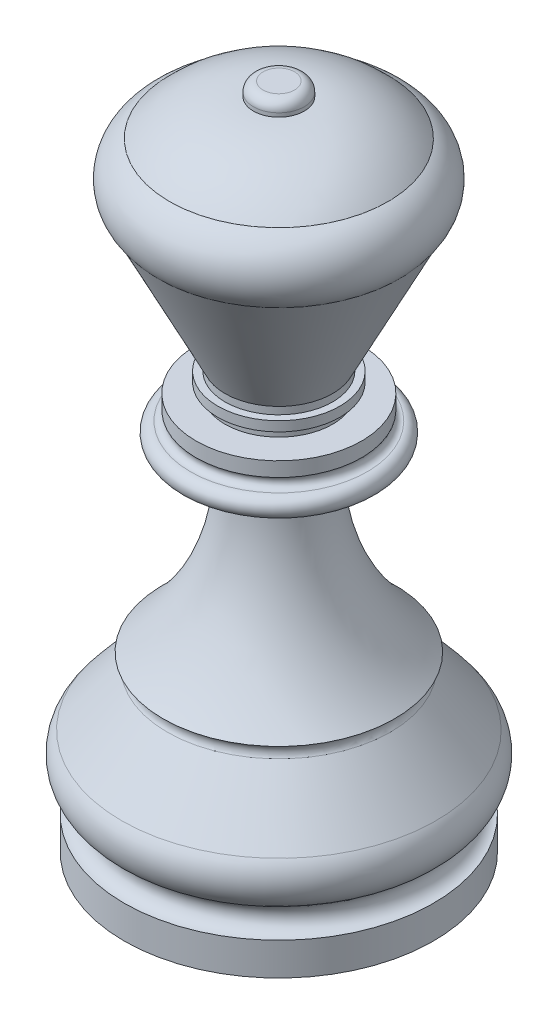
ISO-10303-21;
HEADER;
FILE_DESCRIPTION(('STEP AP214'),'2;1');
FILE_NAME('part.step','',(''),(''),'','','');
FILE_SCHEMA(('AUTOMOTIVE_DESIGN { 1 0 10303 214 1 1 1 1 }'));
ENDSEC;
DATA;
#1=APPLICATION_CONTEXT('core data for automotive mechanical design processes');
#2=APPLICATION_PROTOCOL_DEFINITION('international standard','automotive_design',2000,#1);
#3=PRODUCT_CONTEXT('',#1,'mechanical');
#4=PRODUCT('Part','Part','',(#3));
#5=PRODUCT_RELATED_PRODUCT_CATEGORY('part','',(#4));
#6=PRODUCT_DEFINITION_FORMATION('','',#4);
#7=PRODUCT_DEFINITION_CONTEXT('part definition',#1,'design');
#8=PRODUCT_DEFINITION('design','',#6,#7);
#9=PRODUCT_DEFINITION_SHAPE('','',#8);
#10=(LENGTH_UNIT() NAMED_UNIT(*) SI_UNIT(.MILLI.,.METRE.));
#11=(NAMED_UNIT(*) PLANE_ANGLE_UNIT() SI_UNIT($,.RADIAN.));
#12=(NAMED_UNIT(*) SI_UNIT($,.STERADIAN.) SOLID_ANGLE_UNIT());
#13=UNCERTAINTY_MEASURE_WITH_UNIT(LENGTH_MEASURE(1.E-05),#10,'distance_accuracy_value','');
#14=(GEOMETRIC_REPRESENTATION_CONTEXT(3) GLOBAL_UNCERTAINTY_ASSIGNED_CONTEXT((#13)) GLOBAL_UNIT_ASSIGNED_CONTEXT((#10,
#11,#12)) REPRESENTATION_CONTEXT('',''));
#15=CARTESIAN_POINT('',(0.,0.,0.));
#16=DIRECTION('',(0.,0.,1.));
#17=DIRECTION('',(1.,0.,0.));
#18=AXIS2_PLACEMENT_3D('',#15,#16,#17);
#19=CARTESIAN_POINT('',(-8.51943707080836,-30.9410917334477,0.));
#20=DIRECTION('',(0.,1.,0.));
#21=DIRECTION('',(0.,0.,1.));
#22=AXIS2_PLACEMENT_3D('',#19,#20,#21);
#23=PLANE('',#22);
#24=CARTESIAN_POINT('',(-8.51943707080836,-30.9410917334477,0.));
#25=DIRECTION('',(0.,1.,0.));
#26=DIRECTION('',(0.,0.,1.));
#27=AXIS2_PLACEMENT_3D('',#24,#25,#26);
#28=CIRCLE('',#27,16.);
#29=CARTESIAN_POINT('',(-8.51943707080836,-30.9410917334477,16.));
#30=VERTEX_POINT('',#29);
#31=EDGE_CURVE('E43',#30,#30,#28,.T.);
#32=ORIENTED_EDGE('',*,*,#31,.F.);
#33=EDGE_LOOP('',(#32));
#34=FACE_BOUND('',#33,.T.);
#35=ADVANCED_FACE('F32',(#34),#23,.F.);
#36=CARTESIAN_POINT('',(-8.51943707080836,57.1011253782189,0.));
#37=DIRECTION('',(0.,1.,0.));
#38=DIRECTION('',(0.,0.,1.));
#39=AXIS2_PLACEMENT_3D('',#36,#37,#38);
#40=CYLINDRICAL_SURFACE('',#39,16.);
#41=CARTESIAN_POINT('',(-8.51943707080836,-27.5522507537755,0.));
#42=DIRECTION('',(0.,1.,0.));
#43=DIRECTION('',(0.,0.,1.));
#44=AXIS2_PLACEMENT_3D('',#41,#42,#43);
#45=CIRCLE('',#44,16.);
#46=CARTESIAN_POINT('',(-8.51943707080836,-27.5522507537755,16.));
#47=VERTEX_POINT('',#46);
#48=EDGE_CURVE('E47',#47,#47,#45,.T.);
#49=ORIENTED_EDGE('',*,*,#48,.F.);
#50=EDGE_LOOP('',(#49));
#51=FACE_BOUND('',#50,.T.);
#52=ORIENTED_EDGE('',*,*,#31,.T.);
#53=EDGE_LOOP('',(#52));
#54=FACE_BOUND('',#53,.T.);
#55=ADVANCED_FACE('F214',(#51,#54),#40,.T.);
#56=CARTESIAN_POINT('',(-8.51943707080836,-26.1805804915288,0.));
#57=DIRECTION('',(0.,1.,0.));
#58=DIRECTION('',(0.,0.,1.));
#59=AXIS2_PLACEMENT_3D('',#56,#57,#58);
#60=TOROIDAL_SURFACE('',#59,16.0005608776366,1.37167037691848);
#61=CARTESIAN_POINT('',(-8.51943707080836,-24.9761829016811,0.));
#62=DIRECTION('',(0.,1.,0.));
#63=DIRECTION('',(0.,0.,1.));
#64=AXIS2_PLACEMENT_3D('',#61,#62,#63);
#65=CIRCLE('',#64,15.3441265180204);
#66=CARTESIAN_POINT('',(-8.51943707080836,-24.9761829016811,15.3441265180204));
#67=VERTEX_POINT('',#66);
#68=EDGE_CURVE('E52',#67,#67,#65,.T.);
#69=ORIENTED_EDGE('',*,*,#68,.F.);
#70=EDGE_LOOP('',(#69));
#71=FACE_BOUND('',#70,.T.);
#72=ORIENTED_EDGE('',*,*,#48,.T.);
#73=EDGE_LOOP('',(#72));
#74=FACE_BOUND('',#73,.T.);
#75=ADVANCED_FACE('F208',(#71,#74),#60,.F.);
#76=CARTESIAN_POINT('',(-8.51943707080836,-22.1223697492643,0.));
#77=DIRECTION('',(0.,1.,0.));
#78=DIRECTION('',(0.,0.,1.));
#79=AXIS2_PLACEMENT_3D('',#76,#77,#78);
#80=TOROIDAL_SURFACE('',#79,13.7887090836433,3.25016505797339);
#81=CARTESIAN_POINT('',(-8.51943707080836,-20.0216555323054,0.));
#82=DIRECTION('',(0.,1.,0.));
#83=DIRECTION('',(0.,0.,1.));
#84=AXIS2_PLACEMENT_3D('',#81,#82,#83);
#85=CIRCLE('',#84,16.2687438984671);
#86=CARTESIAN_POINT('',(-8.51943707080836,-20.0216555323054,16.2687438984671));
#87=VERTEX_POINT('',#86);
#88=EDGE_CURVE('E55',#87,#87,#85,.T.);
#89=ORIENTED_EDGE('',*,*,#88,.F.);
#90=EDGE_LOOP('',(#89));
#91=FACE_BOUND('',#90,.T.);
#92=ORIENTED_EDGE('',*,*,#68,.T.);
#93=EDGE_LOOP('',(#92));
#94=FACE_BOUND('',#93,.T.);
#95=ADVANCED_FACE('F202',(#91,#94),#80,.T.);
#96=CARTESIAN_POINT('',(-8.51943707080836,-20.0216555323054,0.));
#97=DIRECTION('',(0.,-1.,0.));
#98=DIRECTION('',(0.,0.,-1.));
#99=AXIS2_PLACEMENT_3D('',#96,#97,#98);
#100=CONICAL_SURFACE('',#99,16.2687438984671,0.702779112860352);
#101=CARTESIAN_POINT('',(-8.51943707080836,-14.4471847713493,0.));
#102=DIRECTION('',(0.,1.,0.));
#103=DIRECTION('',(0.,0.,1.));
#104=AXIS2_PLACEMENT_3D('',#101,#102,#103);
#105=CIRCLE('',#104,11.5468868061527);
#106=CARTESIAN_POINT('',(-8.51943707080836,-14.4471847713493,11.5468868061527));
#107=VERTEX_POINT('',#106);
#108=EDGE_CURVE('E58',#107,#107,#105,.T.);
#109=ORIENTED_EDGE('',*,*,#108,.F.);
#110=EDGE_LOOP('',(#109));
#111=FACE_BOUND('',#110,.T.);
#112=ORIENTED_EDGE('',*,*,#88,.T.);
#113=EDGE_LOOP('',(#112));
#114=FACE_BOUND('',#113,.T.);
#115=ADVANCED_FACE('F196',(#111,#114),#100,.T.);
#116=CARTESIAN_POINT('',(-8.51943707080836,-13.8889026546304,0.));
#117=DIRECTION('',(0.,1.,0.));
#118=DIRECTION('',(0.,0.,1.));
#119=AXIS2_PLACEMENT_3D('',#116,#117,#118);
#120=TOROIDAL_SURFACE('',#119,12.2575928339455,0.903759912692101);
#121=CARTESIAN_POINT('',(-8.51943707080836,-13.026624139719,0.));
#122=DIRECTION('',(0.,1.,0.));
#123=DIRECTION('',(0.,0.,1.));
#124=AXIS2_PLACEMENT_3D('',#121,#122,#123);
#125=CIRCLE('',#124,11.9869311585806);
#126=CARTESIAN_POINT('',(-8.51943707080836,-13.026624139719,11.9869311585806));
#127=VERTEX_POINT('',#126);
#128=EDGE_CURVE('E61',#127,#127,#125,.T.);
#129=ORIENTED_EDGE('',*,*,#128,.F.);
#130=EDGE_LOOP('',(#129));
#131=FACE_BOUND('',#130,.T.);
#132=ORIENTED_EDGE('',*,*,#108,.T.);
#133=EDGE_LOOP('',(#132));
#134=FACE_BOUND('',#133,.T.);
#135=ADVANCED_FACE('F190',(#131,#134),#120,.F.);
#136=CARTESIAN_POINT('',(-8.51943707080836,3.40750140100441,0.));
#137=DIRECTION('',(0.,1.,0.));
#138=DIRECTION('',(0.,0.,1.));
#139=AXIS2_PLACEMENT_3D('',#136,#137,#138);
#140=TOROIDAL_SURFACE('',#139,27.1403266869844,22.3541020470183);
#141=CARTESIAN_POINT('',(-8.51943707080836,5.6490304252635,0.));
#142=DIRECTION('',(0.,1.,0.));
#143=DIRECTION('',(0.,0.,1.));
#144=AXIS2_PLACEMENT_3D('',#141,#142,#143);
#145=CIRCLE('',#144,4.89889179707879);
#146=CARTESIAN_POINT('',(-8.51943707080836,5.6490304252635,4.89889179707879));
#147=VERTEX_POINT('',#146);
#148=EDGE_CURVE('E64',#147,#147,#145,.T.);
#149=ORIENTED_EDGE('',*,*,#148,.F.);
#150=EDGE_LOOP('',(#149));
#151=FACE_BOUND('',#150,.T.);
#152=ORIENTED_EDGE('',*,*,#128,.T.);
#153=EDGE_LOOP('',(#152));
#154=FACE_BOUND('',#153,.T.);
#155=ADVANCED_FACE('F184',(#151,#154),#140,.F.);
#156=CARTESIAN_POINT('',(0.621823835448105,5.64903042526349,0.));
#157=DIRECTION('',(0.,1.,0.));
#158=DIRECTION('',(0.,0.,1.));
#159=AXIS2_PLACEMENT_3D('',#156,#157,#158);
#160=PLANE('',#159);
#161=CARTESIAN_POINT('',(-8.51943707080836,5.64903042526349,0.));
#162=DIRECTION('',(0.,1.,0.));
#163=DIRECTION('',(0.,0.,1.));
#164=AXIS2_PLACEMENT_3D('',#161,#162,#163);
#165=CIRCLE('',#164,9.14126090625646);
#166=CARTESIAN_POINT('',(-8.51943707080836,5.64903042526349,9.14126090625646));
#167=VERTEX_POINT('',#166);
#168=EDGE_CURVE('E67',#167,#167,#165,.T.);
#169=ORIENTED_EDGE('',*,*,#168,.F.);
#170=EDGE_LOOP('',(#169));
#171=FACE_BOUND('',#170,.T.);
#172=ORIENTED_EDGE('',*,*,#148,.T.);
#173=EDGE_LOOP('',(#172));
#174=FACE_BOUND('',#173,.T.);
#175=ADVANCED_FACE('F178',(#171,#174),#160,.F.);
#176=CARTESIAN_POINT('',(-8.51943707080836,6.66406017254272,0.));
#177=DIRECTION('',(0.,1.,0.));
#178=DIRECTION('',(0.,0.,1.));
#179=AXIS2_PLACEMENT_3D('',#176,#177,#178);
#180=TOROIDAL_SURFACE('',#179,9.14126090625646,1.01502974727923);
#181=CARTESIAN_POINT('',(-8.51943707080836,7.67908991982194,0.));
#182=DIRECTION('',(0.,1.,0.));
#183=DIRECTION('',(0.,0.,1.));
#184=AXIS2_PLACEMENT_3D('',#181,#182,#183);
#185=CIRCLE('',#184,9.14126090625646);
#186=CARTESIAN_POINT('',(-8.51943707080836,7.67908991982194,9.14126090625646));
#187=VERTEX_POINT('',#186);
#188=EDGE_CURVE('E70',#187,#187,#185,.T.);
#189=ORIENTED_EDGE('',*,*,#188,.F.);
#190=EDGE_LOOP('',(#189));
#191=FACE_BOUND('',#190,.T.);
#192=ORIENTED_EDGE('',*,*,#168,.T.);
#193=EDGE_LOOP('',(#192));
#194=FACE_BOUND('',#193,.T.);
#195=ADVANCED_FACE('F172',(#191,#194),#180,.T.);
#196=CARTESIAN_POINT('',(-8.51943707080836,8.30580062797284,0.));
#197=DIRECTION('',(0.,1.,0.));
#198=DIRECTION('',(0.,0.,1.));
#199=AXIS2_PLACEMENT_3D('',#196,#197,#198);
#200=TOROIDAL_SURFACE('',#199,9.0913771794894,0.62869284862098);
#201=CARTESIAN_POINT('',(-8.51943707080836,8.64913085936712,0.));
#202=DIRECTION('',(0.,1.,0.));
#203=DIRECTION('',(0.,0.,1.));
#204=AXIS2_PLACEMENT_3D('',#201,#202,#203);
#205=CIRCLE('',#204,8.56470930490627);
#206=CARTESIAN_POINT('',(-8.51943707080836,8.64913085936712,8.56470930490627));
#207=VERTEX_POINT('',#206);
#208=EDGE_CURVE('E73',#207,#207,#205,.T.);
#209=ORIENTED_EDGE('',*,*,#208,.F.);
#210=EDGE_LOOP('',(#209));
#211=FACE_BOUND('',#210,.T.);
#212=ORIENTED_EDGE('',*,*,#188,.T.);
#213=EDGE_LOOP('',(#212));
#214=FACE_BOUND('',#213,.T.);
#215=ADVANCED_FACE('F166',(#211,#214),#200,.F.);
#216=CARTESIAN_POINT('',(-8.51943707080836,57.1011253782189,0.));
#217=DIRECTION('',(0.,1.,0.));
#218=DIRECTION('',(0.,0.,1.));
#219=AXIS2_PLACEMENT_3D('',#216,#217,#218);
#220=CYLINDRICAL_SURFACE('',#219,8.56470930490627);
#221=CARTESIAN_POINT('',(-8.51943707080836,10.1491308593671,0.));
#222=DIRECTION('',(0.,1.,0.));
#223=DIRECTION('',(0.,0.,1.));
#224=AXIS2_PLACEMENT_3D('',#221,#222,#223);
#225=CIRCLE('',#224,8.56470930490627);
#226=CARTESIAN_POINT('',(-8.51943707080836,10.1491308593671,8.56470930490627));
#227=VERTEX_POINT('',#226);
#228=EDGE_CURVE('E76',#227,#227,#225,.T.);
#229=ORIENTED_EDGE('',*,*,#228,.F.);
#230=EDGE_LOOP('',(#229));
#231=FACE_BOUND('',#230,.T.);
#232=ORIENTED_EDGE('',*,*,#208,.T.);
#233=EDGE_LOOP('',(#232));
#234=FACE_BOUND('',#233,.T.);
#235=ADVANCED_FACE('F160',(#231,#234),#220,.T.);
#236=CARTESIAN_POINT('',(-2.95472776590208,10.1491308593671,0.));
#237=DIRECTION('',(0.,-1.,0.));
#238=DIRECTION('',(0.,0.,-1.));
#239=AXIS2_PLACEMENT_3D('',#236,#237,#238);
#240=PLANE('',#239);
#241=CARTESIAN_POINT('',(-8.51943707080836,10.1491308593671,0.));
#242=DIRECTION('',(0.,1.,0.));
#243=DIRECTION('',(0.,0.,1.));
#244=AXIS2_PLACEMENT_3D('',#241,#242,#243);
#245=CIRCLE('',#244,5.56470930490627);
#246=CARTESIAN_POINT('',(-8.51943707080836,10.1491308593671,5.56470930490627));
#247=VERTEX_POINT('',#246);
#248=EDGE_CURVE('E79',#247,#247,#245,.T.);
#249=ORIENTED_EDGE('',*,*,#248,.F.);
#250=EDGE_LOOP('',(#249));
#251=FACE_BOUND('',#250,.T.);
#252=ORIENTED_EDGE('',*,*,#228,.T.);
#253=EDGE_LOOP('',(#252));
#254=FACE_BOUND('',#253,.T.);
#255=ADVANCED_FACE('F154',(#251,#254),#240,.F.);
#256=CARTESIAN_POINT('',(-8.51943707080836,57.1011253782189,0.));
#257=DIRECTION('',(0.,1.,0.));
#258=DIRECTION('',(0.,0.,1.));
#259=AXIS2_PLACEMENT_3D('',#256,#257,#258);
#260=CYLINDRICAL_SURFACE('',#259,5.56470930490628);
#261=CARTESIAN_POINT('',(-8.51943707080836,11.1491308593671,0.));
#262=DIRECTION('',(0.,1.,0.));
#263=DIRECTION('',(0.,0.,1.));
#264=AXIS2_PLACEMENT_3D('',#261,#262,#263);
#265=CIRCLE('',#264,5.56470930490628);
#266=CARTESIAN_POINT('',(-8.51943707080836,11.1491308593671,5.56470930490628));
#267=VERTEX_POINT('',#266);
#268=EDGE_CURVE('E82',#267,#267,#265,.T.);
#269=ORIENTED_EDGE('',*,*,#268,.F.);
#270=EDGE_LOOP('',(#269));
#271=FACE_BOUND('',#270,.T.);
#272=ORIENTED_EDGE('',*,*,#248,.T.);
#273=EDGE_LOOP('',(#272));
#274=FACE_BOUND('',#273,.T.);
#275=ADVANCED_FACE('F148',(#271,#274),#260,.T.);
#276=CARTESIAN_POINT('',(-2.20472776590208,11.1491308593671,0.));
#277=DIRECTION('',(0.,1.,0.));
#278=DIRECTION('',(0.,0.,1.));
#279=AXIS2_PLACEMENT_3D('',#276,#277,#278);
#280=PLANE('',#279);
#281=CARTESIAN_POINT('',(-8.51943707080836,11.1491308593671,0.));
#282=DIRECTION('',(0.,1.,0.));
#283=DIRECTION('',(0.,0.,1.));
#284=AXIS2_PLACEMENT_3D('',#281,#282,#283);
#285=CIRCLE('',#284,6.31470930490628);
#286=CARTESIAN_POINT('',(-8.51943707080836,11.1491308593671,6.31470930490628));
#287=VERTEX_POINT('',#286);
#288=EDGE_CURVE('E85',#287,#287,#285,.T.);
#289=ORIENTED_EDGE('',*,*,#288,.F.);
#290=EDGE_LOOP('',(#289));
#291=FACE_BOUND('',#290,.T.);
#292=ORIENTED_EDGE('',*,*,#268,.T.);
#293=EDGE_LOOP('',(#292));
#294=FACE_BOUND('',#293,.T.);
#295=ADVANCED_FACE('F142',(#291,#294),#280,.F.);
#296=CARTESIAN_POINT('',(-8.51943707080836,57.1011253782189,0.));
#297=DIRECTION('',(0.,1.,0.));
#298=DIRECTION('',(0.,0.,1.));
#299=AXIS2_PLACEMENT_3D('',#296,#297,#298);
#300=CYLINDRICAL_SURFACE('',#299,6.31470930490628);
#301=CARTESIAN_POINT('',(-8.51943707080836,12.1491308593671,0.));
#302=DIRECTION('',(0.,1.,0.));
#303=DIRECTION('',(0.,0.,1.));
#304=AXIS2_PLACEMENT_3D('',#301,#302,#303);
#305=CIRCLE('',#304,6.31470930490628);
#306=CARTESIAN_POINT('',(-8.51943707080836,12.1491308593671,6.31470930490628));
#307=VERTEX_POINT('',#306);
#308=EDGE_CURVE('E88',#307,#307,#305,.T.);
#309=ORIENTED_EDGE('',*,*,#308,.F.);
#310=EDGE_LOOP('',(#309));
#311=FACE_BOUND('',#310,.T.);
#312=ORIENTED_EDGE('',*,*,#288,.T.);
#313=EDGE_LOOP('',(#312));
#314=FACE_BOUND('',#313,.T.);
#315=ADVANCED_FACE('F136',(#311,#314),#300,.T.);
#316=CARTESIAN_POINT('',(-2.95472776590208,12.1491308593671,0.));
#317=DIRECTION('',(0.,-1.,0.));
#318=DIRECTION('',(0.,0.,-1.));
#319=AXIS2_PLACEMENT_3D('',#316,#317,#318);
#320=PLANE('',#319);
#321=CARTESIAN_POINT('',(-8.51943707080836,12.1491308593671,0.));
#322=DIRECTION('',(0.,1.,0.));
#323=DIRECTION('',(0.,0.,1.));
#324=AXIS2_PLACEMENT_3D('',#321,#322,#323);
#325=CIRCLE('',#324,5.56470930490628);
#326=CARTESIAN_POINT('',(-8.51943707080836,12.1491308593671,5.56470930490628));
#327=VERTEX_POINT('',#326);
#328=EDGE_CURVE('E91',#327,#327,#325,.T.);
#329=ORIENTED_EDGE('',*,*,#328,.F.);
#330=EDGE_LOOP('',(#329));
#331=FACE_BOUND('',#330,.T.);
#332=ORIENTED_EDGE('',*,*,#308,.T.);
#333=EDGE_LOOP('',(#332));
#334=FACE_BOUND('',#333,.T.);
#335=ADVANCED_FACE('F130',(#331,#334),#320,.F.);
#336=CARTESIAN_POINT('',(-8.51943707080836,57.1011253782189,0.));
#337=DIRECTION('',(0.,1.,0.));
#338=DIRECTION('',(0.,0.,1.));
#339=AXIS2_PLACEMENT_3D('',#336,#337,#338);
#340=CYLINDRICAL_SURFACE('',#339,5.56470930490628);
#341=CARTESIAN_POINT('',(-8.51943707080836,12.8991308593671,0.));
#342=DIRECTION('',(0.,1.,0.));
#343=DIRECTION('',(0.,0.,1.));
#344=AXIS2_PLACEMENT_3D('',#341,#342,#343);
#345=CIRCLE('',#344,5.56470930490628);
#346=CARTESIAN_POINT('',(-8.51943707080836,12.8991308593671,5.56470930490628));
#347=VERTEX_POINT('',#346);
#348=EDGE_CURVE('E94',#347,#347,#345,.T.);
#349=ORIENTED_EDGE('',*,*,#348,.F.);
#350=EDGE_LOOP('',(#349));
#351=FACE_BOUND('',#350,.T.);
#352=ORIENTED_EDGE('',*,*,#328,.T.);
#353=EDGE_LOOP('',(#352));
#354=FACE_BOUND('',#353,.T.);
#355=ADVANCED_FACE('F124',(#351,#354),#340,.T.);
#356=CARTESIAN_POINT('',(-8.51943707080836,12.8991308593671,0.));
#357=DIRECTION('',(0.,1.,0.));
#358=DIRECTION('',(0.,0.,1.));
#359=AXIS2_PLACEMENT_3D('',#356,#357,#358);
#360=CONICAL_SURFACE('',#359,5.56470930490628,0.465375494081099);
#361=CARTESIAN_POINT('',(-8.51943707080836,26.6094812434803,0.));
#362=DIRECTION('',(0.,1.,0.));
#363=DIRECTION('',(0.,0.,1.));
#364=AXIS2_PLACEMENT_3D('',#361,#362,#363);
#365=CIRCLE('',#364,12.4495225193497);
#366=CARTESIAN_POINT('',(-8.51943707080836,26.6094812434803,12.4495225193497));
#367=VERTEX_POINT('',#366);
#368=EDGE_CURVE('E97',#367,#367,#365,.T.);
#369=ORIENTED_EDGE('',*,*,#368,.F.);
#370=EDGE_LOOP('',(#369));
#371=FACE_BOUND('',#370,.T.);
#372=ORIENTED_EDGE('',*,*,#348,.T.);
#373=EDGE_LOOP('',(#372));
#374=FACE_BOUND('',#373,.T.);
#375=ADVANCED_FACE('F118',(#371,#374),#360,.T.);
#376=CARTESIAN_POINT('',(-8.51943707080836,29.3803750916406,0.));
#377=DIRECTION('',(0.,1.,0.));
#378=DIRECTION('',(0.,0.,1.));
#379=AXIS2_PLACEMENT_3D('',#376,#377,#378);
#380=TOROIDAL_SURFACE('',#379,9.56470930490627,4.);
#381=CARTESIAN_POINT('',(-8.51943707080836,32.9783469512911,0.));
#382=DIRECTION('',(0.,1.,0.));
#383=DIRECTION('',(0.,0.,1.));
#384=AXIS2_PLACEMENT_3D('',#381,#382,#383);
#385=CIRCLE('',#384,11.3124502746047);
#386=CARTESIAN_POINT('',(-8.51943707080836,32.9783469512911,11.3124502746047));
#387=VERTEX_POINT('',#386);
#388=EDGE_CURVE('E100',#387,#387,#385,.T.);
#389=ORIENTED_EDGE('',*,*,#388,.F.);
#390=EDGE_LOOP('',(#389));
#391=FACE_BOUND('',#390,.T.);
#392=ORIENTED_EDGE('',*,*,#368,.T.);
#393=EDGE_LOOP('',(#392));
#394=FACE_BOUND('',#393,.T.);
#395=ADVANCED_FACE('F112',(#391,#394),#380,.T.);
#396=CARTESIAN_POINT('',(-8.51943707080836,24.8490276773816,0.));
#397=DIRECTION('',(0.,1.,0.));
#398=DIRECTION('',(0.,0.,1.));
#399=AXIS2_PLACEMENT_3D('',#396,#397,#398);
#400=DEGENERATE_TOROIDAL_SURFACE('',#399,2.63067813257489,11.893653744047,.T.);
#401=CARTESIAN_POINT('',(-8.51943707080836,36.7426814193202,0.));
#402=DIRECTION('',(0.,1.,0.));
#403=DIRECTION('',(0.,0.,1.));
#404=AXIS2_PLACEMENT_3D('',#401,#402,#403);
#405=CIRCLE('',#404,2.6304541875835);
#406=CARTESIAN_POINT('',(-8.51943707080836,36.7426814193202,2.6304541875835));
#407=VERTEX_POINT('',#406);
#408=EDGE_CURVE('E103',#407,#407,#405,.T.);
#409=ORIENTED_EDGE('',*,*,#408,.F.);
#410=EDGE_LOOP('',(#409));
#411=FACE_BOUND('',#410,.T.);
#412=ORIENTED_EDGE('',*,*,#388,.T.);
#413=EDGE_LOOP('',(#412));
#414=FACE_BOUND('',#413,.T.);
#415=ADVANCED_FACE('F109',(#411,#414),#400,.T.);
#416=CARTESIAN_POINT('',(-8.51943707080836,57.1011253782189,0.));
#417=DIRECTION('',(0.,1.,0.));
#418=DIRECTION('',(0.,0.,1.));
#419=AXIS2_PLACEMENT_3D('',#416,#417,#418);
#420=CYLINDRICAL_SURFACE('',#419,2.6304541875835);
#421=CARTESIAN_POINT('',(-8.51943707080836,37.1348937183756,0.));
#422=DIRECTION('',(0.,-1.,0.));
#423=DIRECTION('',(0.,0.,-1.));
#424=AXIS2_PLACEMENT_3D('',#421,#422,#423);
#425=CIRCLE('',#424,2.6304541875835);
#426=CARTESIAN_POINT('',(-8.51943707080836,37.1348937183756,-2.6304541875835));
#427=VERTEX_POINT('',#426);
#428=EDGE_CURVE('E10',#427,#427,#425,.T.);
#429=ORIENTED_EDGE('',*,*,#428,.T.);
#430=EDGE_LOOP('',(#429));
#431=FACE_BOUND('',#430,.T.);
#432=ORIENTED_EDGE('',*,*,#408,.T.);
#433=EDGE_LOOP('',(#432));
#434=FACE_BOUND('',#433,.T.);
#435=ADVANCED_FACE('F107',(#431,#434),#420,.T.);
#436=CARTESIAN_POINT('',(-5.88898288322485,38.1348937183756,0.));
#437=DIRECTION('',(0.,-1.,0.));
#438=DIRECTION('',(0.,0.,-1.));
#439=AXIS2_PLACEMENT_3D('',#436,#437,#438);
#440=PLANE('',#439);
#441=CARTESIAN_POINT('',(-8.51943707080836,38.1348937183756,0.));
#442=DIRECTION('',(0.,-1.,0.));
#443=DIRECTION('',(0.,0.,-1.));
#444=AXIS2_PLACEMENT_3D('',#441,#442,#443);
#445=CIRCLE('',#444,1.6304541875835);
#446=CARTESIAN_POINT('',(-8.51943707080836,38.1348937183756,-1.6304541875835));
#447=VERTEX_POINT('',#446);
#448=EDGE_CURVE('E39',#447,#447,#445,.F.);
#449=ORIENTED_EDGE('',*,*,#448,.T.);
#450=EDGE_LOOP('',(#449));
#451=FACE_BOUND('',#450,.T.);
#452=ADVANCED_FACE('F229',(#451),#440,.F.);
#453=CARTESIAN_POINT('',(-8.51943707080836,37.1348937183756,0.));
#454=DIRECTION('',(0.,-1.,0.));
#455=DIRECTION('',(0.,0.,-1.));
#456=AXIS2_PLACEMENT_3D('',#453,#454,#455);
#457=TOROIDAL_SURFACE('',#456,1.6304541875835,1.);
#458=ORIENTED_EDGE('',*,*,#428,.F.);
#459=EDGE_LOOP('',(#458));
#460=FACE_BOUND('',#459,.T.);
#461=ORIENTED_EDGE('',*,*,#448,.F.);
#462=EDGE_LOOP('',(#461));
#463=FACE_BOUND('',#462,.T.);
#464=ADVANCED_FACE('F34',(#460,#463),#457,.T.);
#465=CLOSED_SHELL('',(#35,#55,#75,#95,#115,#135,#155,#175,#195,#215,#235,#255,#275,#295,#315,
#335,#355,#375,#395,#415,#435,#452,#464));
#466=MANIFOLD_SOLID_BREP('B2',#465);
#467=ADVANCED_BREP_SHAPE_REPRESENTATION('',(#18,#466),#14);
#468=SHAPE_DEFINITION_REPRESENTATION(#9,#467);
ENDSEC;
END-ISO-10303-21;
